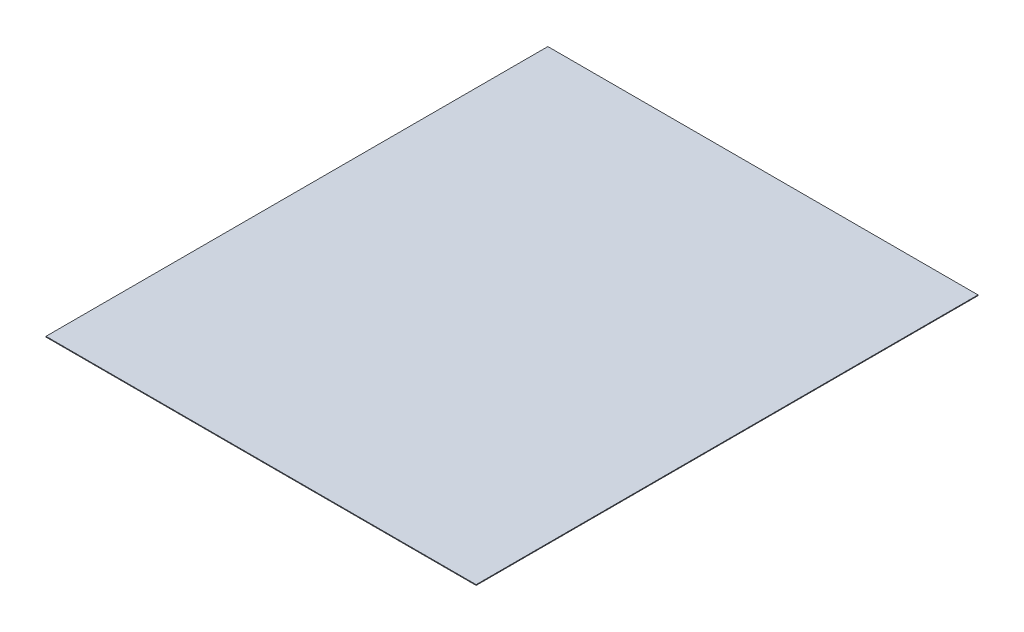
ISO-10303-21;
HEADER;
FILE_DESCRIPTION(('STEP AP214'),'2;1');
FILE_NAME('part.step','',(''),(''),'','','');
FILE_SCHEMA(('AUTOMOTIVE_DESIGN { 1 0 10303 214 1 1 1 1 }'));
ENDSEC;
DATA;
#1=APPLICATION_CONTEXT('core data for automotive mechanical design processes');
#2=APPLICATION_PROTOCOL_DEFINITION('international standard','automotive_design',2000,#1);
#3=PRODUCT_CONTEXT('',#1,'mechanical');
#4=PRODUCT('Part','Part','',(#3));
#5=PRODUCT_RELATED_PRODUCT_CATEGORY('part','',(#4));
#6=PRODUCT_DEFINITION_FORMATION('','',#4);
#7=PRODUCT_DEFINITION_CONTEXT('part definition',#1,'design');
#8=PRODUCT_DEFINITION('design','',#6,#7);
#9=PRODUCT_DEFINITION_SHAPE('','',#8);
#10=(LENGTH_UNIT() NAMED_UNIT(*) SI_UNIT(.MILLI.,.METRE.));
#11=(NAMED_UNIT(*) PLANE_ANGLE_UNIT() SI_UNIT($,.RADIAN.));
#12=(NAMED_UNIT(*) SI_UNIT($,.STERADIAN.) SOLID_ANGLE_UNIT());
#13=UNCERTAINTY_MEASURE_WITH_UNIT(LENGTH_MEASURE(1.E-05),#10,'distance_accuracy_value','');
#14=(GEOMETRIC_REPRESENTATION_CONTEXT(3) GLOBAL_UNCERTAINTY_ASSIGNED_CONTEXT((#13)) GLOBAL_UNIT_ASSIGNED_CONTEXT((#10,
#11,#12)) REPRESENTATION_CONTEXT('',''));
#15=CARTESIAN_POINT('',(0.,0.,0.));
#16=DIRECTION('',(0.,0.,1.));
#17=DIRECTION('',(1.,0.,0.));
#18=AXIS2_PLACEMENT_3D('',#15,#16,#17);
#19=CARTESIAN_POINT('',(0.,0.,-70000.));
#20=DIRECTION('',(-1.,0.,0.));
#21=DIRECTION('',(0.,0.,1.));
#22=AXIS2_PLACEMENT_3D('',#19,#20,#21);
#23=PLANE('',#22);
#24=DIRECTION('',(0.,-1.,0.));
#25=VECTOR('',#24,1.);
#26=CARTESIAN_POINT('',(0.,0.,0.));
#27=LINE('',#26,#25);
#28=CARTESIAN_POINT('',(0.,100.,0.));
#29=VERTEX_POINT('',#28);
#30=CARTESIAN_POINT('',(0.,0.,0.));
#31=VERTEX_POINT('',#30);
#32=EDGE_CURVE('E100',#29,#31,#27,.T.);
#33=ORIENTED_EDGE('',*,*,#32,.F.);
#34=DIRECTION('',(0.,0.,1.));
#35=VECTOR('',#34,1.);
#36=CARTESIAN_POINT('',(0.,100.,-70000.));
#37=LINE('',#36,#35);
#38=CARTESIAN_POINT('',(0.,100.,-70000.));
#39=VERTEX_POINT('',#38);
#40=EDGE_CURVE('E11',#39,#29,#37,.T.);
#41=ORIENTED_EDGE('',*,*,#40,.F.);
#42=DIRECTION('',(0.,-1.,0.));
#43=VECTOR('',#42,1.);
#44=CARTESIAN_POINT('',(0.,0.,-70000.));
#45=LINE('',#44,#43);
#46=CARTESIAN_POINT('',(0.,0.,-70000.));
#47=VERTEX_POINT('',#46);
#48=EDGE_CURVE('E94',#39,#47,#45,.T.);
#49=ORIENTED_EDGE('',*,*,#48,.T.);
#50=DIRECTION('',(0.,0.,1.));
#51=VECTOR('',#50,1.);
#52=CARTESIAN_POINT('',(0.,0.,-70000.));
#53=LINE('',#52,#51);
#54=EDGE_CURVE('E39',#47,#31,#53,.T.);
#55=ORIENTED_EDGE('',*,*,#54,.T.);
#56=EDGE_LOOP('',(#33,#41,#49,#55));
#57=FACE_BOUND('',#56,.T.);
#58=ADVANCED_FACE('F36',(#57),#23,.T.);
#59=CARTESIAN_POINT('',(0.,100.,-70000.));
#60=DIRECTION('',(0.,1.,0.));
#61=DIRECTION('',(0.,0.,1.));
#62=AXIS2_PLACEMENT_3D('',#59,#60,#61);
#63=PLANE('',#62);
#64=DIRECTION('',(-1.,0.,0.));
#65=VECTOR('',#64,1.);
#66=CARTESIAN_POINT('',(0.,100.,0.));
#67=LINE('',#66,#65);
#68=CARTESIAN_POINT('',(60000.,100.,0.));
#69=VERTEX_POINT('',#68);
#70=EDGE_CURVE('E96',#69,#29,#67,.T.);
#71=ORIENTED_EDGE('',*,*,#70,.F.);
#72=DIRECTION('',(0.,0.,1.));
#73=VECTOR('',#72,1.);
#74=CARTESIAN_POINT('',(60000.,100.,-70000.));
#75=LINE('',#74,#73);
#76=CARTESIAN_POINT('',(60000.,100.,-70000.));
#77=VERTEX_POINT('',#76);
#78=EDGE_CURVE('E45',#77,#69,#75,.T.);
#79=ORIENTED_EDGE('',*,*,#78,.F.);
#80=DIRECTION('',(-1.,0.,0.));
#81=VECTOR('',#80,1.);
#82=CARTESIAN_POINT('',(0.,100.,-70000.));
#83=LINE('',#82,#81);
#84=EDGE_CURVE('E91',#77,#39,#83,.T.);
#85=ORIENTED_EDGE('',*,*,#84,.T.);
#86=ORIENTED_EDGE('',*,*,#40,.T.);
#87=EDGE_LOOP('',(#71,#79,#85,#86));
#88=FACE_BOUND('',#87,.T.);
#89=ADVANCED_FACE('F110',(#88),#63,.T.);
#90=CARTESIAN_POINT('',(60000.,0.,-70000.));
#91=DIRECTION('',(1.,0.,0.));
#92=DIRECTION('',(0.,0.,-1.));
#93=AXIS2_PLACEMENT_3D('',#90,#91,#92);
#94=PLANE('',#93);
#95=DIRECTION('',(0.,1.,0.));
#96=VECTOR('',#95,1.);
#97=CARTESIAN_POINT('',(60000.,0.,0.));
#98=LINE('',#97,#96);
#99=CARTESIAN_POINT('',(60000.,0.,0.));
#100=VERTEX_POINT('',#99);
#101=EDGE_CURVE('E86',#100,#69,#98,.T.);
#102=ORIENTED_EDGE('',*,*,#101,.F.);
#103=DIRECTION('',(0.,0.,1.));
#104=VECTOR('',#103,1.);
#105=CARTESIAN_POINT('',(60000.,0.,-70000.));
#106=LINE('',#105,#104);
#107=CARTESIAN_POINT('',(60000.,0.,-70000.));
#108=VERTEX_POINT('',#107);
#109=EDGE_CURVE('E81',#108,#100,#106,.T.);
#110=ORIENTED_EDGE('',*,*,#109,.F.);
#111=DIRECTION('',(0.,1.,0.));
#112=VECTOR('',#111,1.);
#113=CARTESIAN_POINT('',(60000.,0.,-70000.));
#114=LINE('',#113,#112);
#115=EDGE_CURVE('E84',#108,#77,#114,.T.);
#116=ORIENTED_EDGE('',*,*,#115,.T.);
#117=ORIENTED_EDGE('',*,*,#78,.T.);
#118=EDGE_LOOP('',(#102,#110,#116,#117));
#119=FACE_BOUND('',#118,.T.);
#120=ADVANCED_FACE('F83',(#119),#94,.T.);
#121=CARTESIAN_POINT('',(0.,0.,-70000.));
#122=DIRECTION('',(0.,-1.,0.));
#123=DIRECTION('',(0.,0.,-1.));
#124=AXIS2_PLACEMENT_3D('',#121,#122,#123);
#125=PLANE('',#124);
#126=DIRECTION('',(1.,0.,0.));
#127=VECTOR('',#126,1.);
#128=CARTESIAN_POINT('',(0.,0.,0.));
#129=LINE('',#128,#127);
#130=EDGE_CURVE('E103',#31,#100,#129,.T.);
#131=ORIENTED_EDGE('',*,*,#130,.F.);
#132=ORIENTED_EDGE('',*,*,#54,.F.);
#133=DIRECTION('',(1.,0.,0.));
#134=VECTOR('',#133,1.);
#135=CARTESIAN_POINT('',(0.,0.,-70000.));
#136=LINE('',#135,#134);
#137=EDGE_CURVE('E90',#47,#108,#136,.T.);
#138=ORIENTED_EDGE('',*,*,#137,.T.);
#139=ORIENTED_EDGE('',*,*,#109,.T.);
#140=EDGE_LOOP('',(#131,#132,#138,#139));
#141=FACE_BOUND('',#140,.T.);
#142=ADVANCED_FACE('F93',(#141),#125,.T.);
#143=CARTESIAN_POINT('',(0.,0.,-70000.));
#144=DIRECTION('',(0.,0.,-1.));
#145=DIRECTION('',(-1.,0.,0.));
#146=AXIS2_PLACEMENT_3D('',#143,#144,#145);
#147=PLANE('',#146);
#148=ORIENTED_EDGE('',*,*,#48,.F.);
#149=ORIENTED_EDGE('',*,*,#84,.F.);
#150=ORIENTED_EDGE('',*,*,#115,.F.);
#151=ORIENTED_EDGE('',*,*,#137,.F.);
#152=EDGE_LOOP('',(#148,#149,#150,#151));
#153=FACE_BOUND('',#152,.T.);
#154=ADVANCED_FACE('F89',(#153),#147,.T.);
#155=CARTESIAN_POINT('',(0.,0.,0.));
#156=DIRECTION('',(0.,0.,-1.));
#157=DIRECTION('',(-1.,0.,0.));
#158=AXIS2_PLACEMENT_3D('',#155,#156,#157);
#159=PLANE('',#158);
#160=ORIENTED_EDGE('',*,*,#32,.T.);
#161=ORIENTED_EDGE('',*,*,#130,.T.);
#162=ORIENTED_EDGE('',*,*,#101,.T.);
#163=ORIENTED_EDGE('',*,*,#70,.T.);
#164=EDGE_LOOP('',(#160,#161,#162,#163));
#165=FACE_BOUND('',#164,.T.);
#166=ADVANCED_FACE('F109',(#165),#159,.F.);
#167=CLOSED_SHELL('',(#58,#89,#120,#142,#154,#166));
#168=MANIFOLD_SOLID_BREP('B2',#167);
#169=ADVANCED_BREP_SHAPE_REPRESENTATION('',(#18,#168),#14);
#170=SHAPE_DEFINITION_REPRESENTATION(#9,#169);
ENDSEC;
END-ISO-10303-21;
